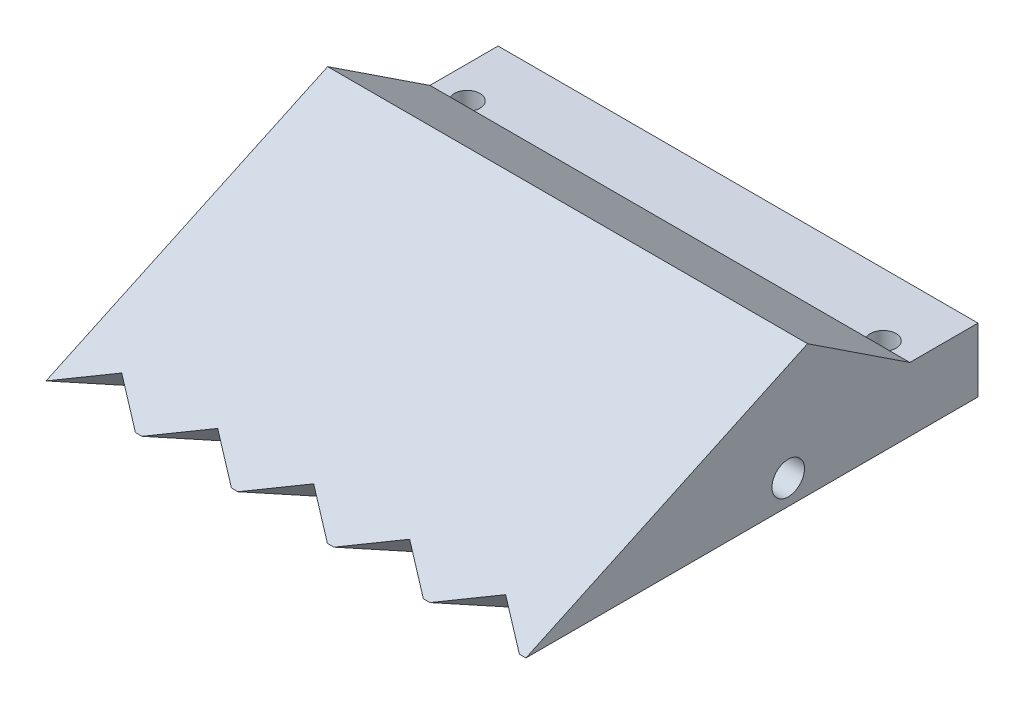
ISO-10303-21;
HEADER;
FILE_DESCRIPTION(('STEP AP214'),'2;1');
FILE_NAME('part.step','',(''),(''),'','','');
FILE_SCHEMA(('AUTOMOTIVE_DESIGN { 1 0 10303 214 1 1 1 1 }'));
ENDSEC;
DATA;
#1=APPLICATION_CONTEXT('core data for automotive mechanical design processes');
#2=APPLICATION_PROTOCOL_DEFINITION('international standard','automotive_design',2000,#1);
#3=PRODUCT_CONTEXT('',#1,'mechanical');
#4=PRODUCT('Part','Part','',(#3));
#5=PRODUCT_RELATED_PRODUCT_CATEGORY('part','',(#4));
#6=PRODUCT_DEFINITION_FORMATION('','',#4);
#7=PRODUCT_DEFINITION_CONTEXT('part definition',#1,'design');
#8=PRODUCT_DEFINITION('design','',#6,#7);
#9=PRODUCT_DEFINITION_SHAPE('','',#8);
#10=(LENGTH_UNIT() NAMED_UNIT(*) SI_UNIT(.MILLI.,.METRE.));
#11=(NAMED_UNIT(*) PLANE_ANGLE_UNIT() SI_UNIT($,.RADIAN.));
#12=(NAMED_UNIT(*) SI_UNIT($,.STERADIAN.) SOLID_ANGLE_UNIT());
#13=UNCERTAINTY_MEASURE_WITH_UNIT(LENGTH_MEASURE(1.E-05),#10,'distance_accuracy_value','');
#14=(GEOMETRIC_REPRESENTATION_CONTEXT(3) GLOBAL_UNCERTAINTY_ASSIGNED_CONTEXT((#13)) GLOBAL_UNIT_ASSIGNED_CONTEXT((#10,
#11,#12)) REPRESENTATION_CONTEXT('',''));
#15=CARTESIAN_POINT('',(0.,0.,0.));
#16=DIRECTION('',(0.,0.,1.));
#17=DIRECTION('',(1.,0.,0.));
#18=AXIS2_PLACEMENT_3D('',#15,#16,#17);
#19=CARTESIAN_POINT('',(75.,24.6994464564003,-8.57109619459907));
#20=DIRECTION('',(0.,-0.906307787036653,-0.422618261740694));
#21=DIRECTION('',(0.,0.422618261740694,-0.906307787036653));
#22=AXIS2_PLACEMENT_3D('',#19,#20,#21);
#23=PLANE('',#22);
#24=DIRECTION('',(0.,-0.422618261740694,0.906307787036653));
#25=VECTOR('',#24,1.);
#26=CARTESIAN_POINT('',(0.,24.6994464564003,-8.57109619459907));
#27=LINE('',#26,#25);
#28=CARTESIAN_POINT('',(0.,24.6994464564003,-8.57109619459907));
#29=VERTEX_POINT('',#28);
#30=CARTESIAN_POINT('',(0.,4.17318887122065,35.4476052489812));
#31=VERTEX_POINT('',#30);
#32=EDGE_CURVE('E256',#29,#31,#27,.T.);
#33=ORIENTED_EDGE('',*,*,#32,.T.);
#34=DIRECTION('',(-0.802159031205733,-0.25234978014748,0.541165849915346));
#35=VECTOR('',#34,1.);
#36=CARTESIAN_POINT('',(0.,4.17318887122065,35.4476052489812));
#37=LINE('',#36,#35);
#38=CARTESIAN_POINT('',(7.06585008190916,6.39602205686052,30.6807240992381));
#39=VERTEX_POINT('',#38);
#40=EDGE_CURVE('E171',#39,#31,#37,.T.);
#41=ORIENTED_EDGE('',*,*,#40,.F.);
#42=DIRECTION('',(-0.795744215045442,0.255951500653194,-0.548889764465591));
#43=VECTOR('',#42,1.);
#44=CARTESIAN_POINT('',(7.06585008190916,6.39602205686052,30.6807240992381));
#45=LINE('',#44,#43);
#46=CARTESIAN_POINT('',(13.9765602905617,4.17318887122065,35.4476052489812));
#47=VERTEX_POINT('',#46);
#48=EDGE_CURVE('E157',#47,#39,#45,.T.);
#49=ORIENTED_EDGE('',*,*,#48,.F.);
#50=DIRECTION('',(-1.,0.,0.));
#51=VECTOR('',#50,1.);
#52=CARTESIAN_POINT('',(75.,4.17318887122065,35.4476052489812));
#53=LINE('',#52,#51);
#54=CARTESIAN_POINT('',(15.,4.17318887122073,35.447605248981));
#55=VERTEX_POINT('',#54);
#56=EDGE_CURVE('E170',#55,#47,#53,.T.);
#57=ORIENTED_EDGE('',*,*,#56,.F.);
#58=DIRECTION('',(-0.802159031205733,-0.25234978014748,0.541165849915346));
#59=VECTOR('',#58,1.);
#60=CARTESIAN_POINT('',(15.,4.17318887122073,35.447605248981));
#61=LINE('',#60,#59);
#62=CARTESIAN_POINT('',(22.0658500819091,6.39602205686061,30.6807240992379));
#63=VERTEX_POINT('',#62);
#64=EDGE_CURVE('E350',#63,#55,#61,.T.);
#65=ORIENTED_EDGE('',*,*,#64,.F.);
#66=DIRECTION('',(-0.795744215045441,0.255951500653194,-0.548889764465591));
#67=VECTOR('',#66,1.);
#68=CARTESIAN_POINT('',(22.0658500819091,6.39602205686061,30.6807240992379));
#69=LINE('',#68,#67);
#70=CARTESIAN_POINT('',(28.9765602905617,4.17318887122073,35.447605248981));
#71=VERTEX_POINT('',#70);
#72=EDGE_CURVE('E235',#71,#63,#69,.T.);
#73=ORIENTED_EDGE('',*,*,#72,.F.);
#74=CARTESIAN_POINT('',(30.,4.17318887122082,35.4476052489808));
#75=VERTEX_POINT('',#74);
#76=EDGE_CURVE('E178',#75,#71,#53,.T.);
#77=ORIENTED_EDGE('',*,*,#76,.F.);
#78=DIRECTION('',(-0.802159031205733,-0.25234978014748,0.541165849915346));
#79=VECTOR('',#78,1.);
#80=CARTESIAN_POINT('',(30.,4.17318887122082,35.4476052489808));
#81=LINE('',#80,#79);
#82=CARTESIAN_POINT('',(37.0658500819091,6.3960220568607,30.6807240992377));
#83=VERTEX_POINT('',#82);
#84=EDGE_CURVE('E220',#83,#75,#81,.T.);
#85=ORIENTED_EDGE('',*,*,#84,.F.);
#86=DIRECTION('',(-0.795744215045441,0.255951500653195,-0.548889764465592));
#87=VECTOR('',#86,1.);
#88=CARTESIAN_POINT('',(37.0658500819091,6.3960220568607,30.6807240992377));
#89=LINE('',#88,#87);
#90=CARTESIAN_POINT('',(43.9765602905616,4.17318887122082,35.4476052489808));
#91=VERTEX_POINT('',#90);
#92=EDGE_CURVE('E218',#91,#83,#89,.T.);
#93=ORIENTED_EDGE('',*,*,#92,.F.);
#94=CARTESIAN_POINT('',(45.,4.17318887122091,35.4476052489806));
#95=VERTEX_POINT('',#94);
#96=EDGE_CURVE('E185',#95,#91,#53,.T.);
#97=ORIENTED_EDGE('',*,*,#96,.F.);
#98=DIRECTION('',(-0.802159031205733,-0.25234978014748,0.541165849915345));
#99=VECTOR('',#98,1.);
#100=CARTESIAN_POINT('',(45.,4.17318887122091,35.4476052489806));
#101=LINE('',#100,#99);
#102=CARTESIAN_POINT('',(52.0658500819091,6.39602205686078,30.6807240992375));
#103=VERTEX_POINT('',#102);
#104=EDGE_CURVE('E215',#103,#95,#101,.T.);
#105=ORIENTED_EDGE('',*,*,#104,.F.);
#106=DIRECTION('',(-0.795744215045441,0.255951500653195,-0.548889764465592));
#107=VECTOR('',#106,1.);
#108=CARTESIAN_POINT('',(52.0658500819091,6.39602205686078,30.6807240992375));
#109=LINE('',#108,#107);
#110=CARTESIAN_POINT('',(58.9765602905616,4.17318887122091,35.4476052489806));
#111=VERTEX_POINT('',#110);
#112=EDGE_CURVE('E236',#111,#103,#109,.T.);
#113=ORIENTED_EDGE('',*,*,#112,.F.);
#114=CARTESIAN_POINT('',(59.9999999999999,4.173188871221,35.4476052489804));
#115=VERTEX_POINT('',#114);
#116=EDGE_CURVE('E193',#115,#111,#53,.T.);
#117=ORIENTED_EDGE('',*,*,#116,.F.);
#118=DIRECTION('',(-0.802159031205733,-0.25234978014748,0.541165849915345));
#119=VECTOR('',#118,1.);
#120=CARTESIAN_POINT('',(59.9999999999999,4.173188871221,35.4476052489804));
#121=LINE('',#120,#119);
#122=CARTESIAN_POINT('',(67.0658500819091,6.39602205686087,30.6807240992373));
#123=VERTEX_POINT('',#122);
#124=EDGE_CURVE('E247',#123,#115,#121,.T.);
#125=ORIENTED_EDGE('',*,*,#124,.F.);
#126=DIRECTION('',(-0.795744215045441,0.255951500653195,-0.548889764465592));
#127=VECTOR('',#126,1.);
#128=CARTESIAN_POINT('',(67.0658500819091,6.39602205686087,30.6807240992373));
#129=LINE('',#128,#127);
#130=CARTESIAN_POINT('',(73.9765602905616,4.173188871221,35.4476052489804));
#131=VERTEX_POINT('',#130);
#132=EDGE_CURVE('E243',#131,#123,#129,.T.);
#133=ORIENTED_EDGE('',*,*,#132,.F.);
#134=CARTESIAN_POINT('',(75.,4.17318887122065,35.4476052489812));
#135=VERTEX_POINT('',#134);
#136=EDGE_CURVE('E181',#135,#131,#53,.T.);
#137=ORIENTED_EDGE('',*,*,#136,.F.);
#138=DIRECTION('',(0.,-0.422618261740694,0.906307787036653));
#139=VECTOR('',#138,1.);
#140=CARTESIAN_POINT('',(75.,24.6994464564003,-8.57109619459907));
#141=LINE('',#140,#139);
#142=CARTESIAN_POINT('',(75.,24.6994464564003,-8.57109619459907));
#143=VERTEX_POINT('',#142);
#144=EDGE_CURVE('E262',#143,#135,#141,.T.);
#145=ORIENTED_EDGE('',*,*,#144,.F.);
#146=DIRECTION('',(-1.,0.,0.));
#147=VECTOR('',#146,1.);
#148=CARTESIAN_POINT('',(75.,24.6994464564003,-8.57109619459907));
#149=LINE('',#148,#147);
#150=EDGE_CURVE('E279',#143,#29,#149,.T.);
#151=ORIENTED_EDGE('',*,*,#150,.T.);
#152=EDGE_LOOP('',(#33,#41,#49,#57,#65,#73,#77,#85,#93,#97,#105,#113,#117,#125,#133,#137,#145,#151));
#153=FACE_BOUND('',#152,.T.);
#154=ADVANCED_FACE('F39',(#153),#23,.F.);
#155=CARTESIAN_POINT('',(75.,4.17318887122065,35.4476052489812));
#156=DIRECTION('',(0.,1.,0.));
#157=DIRECTION('',(0.,0.,1.));
#158=AXIS2_PLACEMENT_3D('',#155,#156,#157);
#159=PLANE('',#158);
#160=CARTESIAN_POINT('',(69.9999989035806,4.17318887122065,-25.3864980543294));
#161=DIRECTION('',(0.,1.,0.));
#162=DIRECTION('',(0.,0.,1.));
#163=AXIS2_PLACEMENT_3D('',#160,#161,#162);
#164=CIRCLE('',#163,3.99999999999999);
#165=CARTESIAN_POINT('',(69.9999989035806,4.17318887122065,-21.3864980543294));
#166=VERTEX_POINT('',#165);
#167=EDGE_CURVE('E377',#166,#166,#164,.T.);
#168=ORIENTED_EDGE('',*,*,#167,.T.);
#169=EDGE_LOOP('',(#168));
#170=FACE_BOUND('',#169,.T.);
#171=CARTESIAN_POINT('',(5.,4.17318887122065,-25.3745592722076));
#172=DIRECTION('',(0.,1.,0.));
#173=DIRECTION('',(0.,0.,1.));
#174=AXIS2_PLACEMENT_3D('',#171,#172,#173);
#175=CIRCLE('',#174,3.99999999999999);
#176=CARTESIAN_POINT('',(5.,4.17318887122065,-21.3745592722076));
#177=VERTEX_POINT('',#176);
#178=EDGE_CURVE('E373',#177,#177,#175,.T.);
#179=ORIENTED_EDGE('',*,*,#178,.T.);
#180=EDGE_LOOP('',(#179));
#181=FACE_BOUND('',#180,.T.);
#182=DIRECTION('',(-0.765791701632656,0.,-0.643088695057347));
#183=VECTOR('',#182,1.);
#184=CARTESIAN_POINT('',(49.7629589494673,4.17318887122065,65.4999398006517));
#185=LINE('',#184,#183);
#186=CARTESIAN_POINT('',(7.06585008190916,4.17318887122065,29.6441999619732));
#187=VERTEX_POINT('',#186);
#188=EDGE_CURVE('E154',#47,#187,#185,.T.);
#189=ORIENTED_EDGE('',*,*,#188,.T.);
#190=DIRECTION('',(-0.772763043523777,0.,0.634694634106724));
#191=VECTOR('',#190,1.);
#192=CARTESIAN_POINT('',(44.7872041077099,4.17318887122065,-1.33753653805802));
#193=LINE('',#192,#191);
#194=EDGE_CURVE('E163',#187,#31,#193,.T.);
#195=ORIENTED_EDGE('',*,*,#194,.T.);
#196=DIRECTION('',(0.,0.,-1.));
#197=VECTOR('',#196,1.);
#198=CARTESIAN_POINT('',(0.,4.17318887122065,35.4476052489812));
#199=LINE('',#198,#197);
#200=CARTESIAN_POINT('',(0.,4.17318887122065,-35.2064814814815));
#201=VERTEX_POINT('',#200);
#202=EDGE_CURVE('E282',#31,#201,#199,.T.);
#203=ORIENTED_EDGE('',*,*,#202,.T.);
#204=DIRECTION('',(-1.,0.,0.));
#205=VECTOR('',#204,1.);
#206=CARTESIAN_POINT('',(75.,4.17318887122065,-35.2064814814815));
#207=LINE('',#206,#205);
#208=CARTESIAN_POINT('',(75.,4.17318887122065,-35.2064814814815));
#209=VERTEX_POINT('',#208);
#210=EDGE_CURVE('E179',#209,#201,#207,.T.);
#211=ORIENTED_EDGE('',*,*,#210,.F.);
#212=DIRECTION('',(0.,0.,-1.));
#213=VECTOR('',#212,1.);
#214=CARTESIAN_POINT('',(75.,4.17318887122065,35.4476052489812));
#215=LINE('',#214,#213);
#216=EDGE_CURVE('E266',#135,#209,#215,.T.);
#217=ORIENTED_EDGE('',*,*,#216,.F.);
#218=ORIENTED_EDGE('',*,*,#136,.T.);
#219=DIRECTION('',(-0.765791701632655,0.,-0.643088695057348));
#220=VECTOR('',#219,1.);
#221=CARTESIAN_POINT('',(74.5767431321014,4.17318887122065,35.9516206353298));
#222=LINE('',#221,#220);
#223=CARTESIAN_POINT('',(67.0658500819091,4.17318887122065,29.6441999619722));
#224=VERTEX_POINT('',#223);
#225=EDGE_CURVE('E192',#131,#224,#222,.T.);
#226=ORIENTED_EDGE('',*,*,#225,.T.);
#227=DIRECTION('',(-0.772763043523779,0.,0.634694634106723));
#228=VECTOR('',#227,1.);
#229=CARTESIAN_POINT('',(68.9574408215415,4.17318887122065,28.0905768915728));
#230=LINE('',#229,#228);
#231=EDGE_CURVE('E198',#224,#115,#230,.T.);
#232=ORIENTED_EDGE('',*,*,#231,.T.);
#233=ORIENTED_EDGE('',*,*,#116,.T.);
#234=DIRECTION('',(-0.765791701632655,0.,-0.643088695057348));
#235=VECTOR('',#234,1.);
#236=CARTESIAN_POINT('',(68.3732970864429,4.17318887122065,43.3387004266603));
#237=LINE('',#236,#235);
#238=CARTESIAN_POINT('',(52.0658500819091,4.17318887122065,29.6441999619725));
#239=VERTEX_POINT('',#238);
#240=EDGE_CURVE('E614',#111,#239,#237,.T.);
#241=ORIENTED_EDGE('',*,*,#240,.T.);
#242=DIRECTION('',(-0.772763043523779,0.,0.634694634106723));
#243=VECTOR('',#242,1.);
#244=CARTESIAN_POINT('',(62.9148816430836,4.17318887122065,20.7335485341651));
#245=LINE('',#244,#243);
#246=EDGE_CURVE('E211',#239,#95,#245,.T.);
#247=ORIENTED_EDGE('',*,*,#246,.T.);
#248=ORIENTED_EDGE('',*,*,#96,.T.);
#249=DIRECTION('',(-0.765791701632655,0.,-0.643088695057348));
#250=VECTOR('',#249,1.);
#251=CARTESIAN_POINT('',(62.1698510407843,4.17318887122065,50.7257802179907));
#252=LINE('',#251,#250);
#253=CARTESIAN_POINT('',(37.0658500819091,4.17318887122065,29.6441999619727));
#254=VERTEX_POINT('',#253);
#255=EDGE_CURVE('E209',#91,#254,#252,.T.);
#256=ORIENTED_EDGE('',*,*,#255,.T.);
#257=DIRECTION('',(-0.772763043523778,0.,0.634694634106723));
#258=VECTOR('',#257,1.);
#259=CARTESIAN_POINT('',(56.8723224646257,4.17318887122065,13.3765201767574));
#260=LINE('',#259,#258);
#261=EDGE_CURVE('E359',#254,#75,#260,.T.);
#262=ORIENTED_EDGE('',*,*,#261,.T.);
#263=ORIENTED_EDGE('',*,*,#76,.T.);
#264=DIRECTION('',(-0.765791701632656,0.,-0.643088695057347));
#265=VECTOR('',#264,1.);
#266=CARTESIAN_POINT('',(55.9664049951258,4.17318887122065,58.1128600093212));
#267=LINE('',#266,#265);
#268=CARTESIAN_POINT('',(22.0658500819092,4.17318887122065,29.6441999619729));
#269=VERTEX_POINT('',#268);
#270=EDGE_CURVE('E357',#71,#269,#267,.T.);
#271=ORIENTED_EDGE('',*,*,#270,.T.);
#272=DIRECTION('',(-0.772763043523778,0.,0.634694634106724));
#273=VECTOR('',#272,1.);
#274=CARTESIAN_POINT('',(50.8297632861678,4.17318887122065,6.01949181934968));
#275=LINE('',#274,#273);
#276=EDGE_CURVE('E164',#269,#55,#275,.T.);
#277=ORIENTED_EDGE('',*,*,#276,.T.);
#278=ORIENTED_EDGE('',*,*,#56,.T.);
#279=EDGE_LOOP('',(#189,#195,#203,#211,#217,#218,#226,#232,#233,#241,#247,#248,#256,#262,#263,
#271,#277,#278));
#280=FACE_BOUND('',#279,.T.);
#281=ADVANCED_FACE('F175',(#170,#181,#280),#159,.F.);
#282=CARTESIAN_POINT('',(75.,4.17318887122065,-35.2064814814815));
#283=DIRECTION('',(0.,0.,1.));
#284=DIRECTION('',(1.,0.,0.));
#285=AXIS2_PLACEMENT_3D('',#282,#283,#284);
#286=PLANE('',#285);
#287=DIRECTION('',(0.,1.,0.));
#288=VECTOR('',#287,1.);
#289=CARTESIAN_POINT('',(0.,4.17318887122065,-35.2064814814815));
#290=LINE('',#289,#288);
#291=CARTESIAN_POINT('',(0.,14.1731888712206,-35.2064814814815));
#292=VERTEX_POINT('',#291);
#293=EDGE_CURVE('E285',#201,#292,#290,.T.);
#294=ORIENTED_EDGE('',*,*,#293,.T.);
#295=DIRECTION('',(-1.,0.,0.));
#296=VECTOR('',#295,1.);
#297=CARTESIAN_POINT('',(75.,14.1731888712206,-35.2064814814815));
#298=LINE('',#297,#296);
#299=CARTESIAN_POINT('',(75.,14.1731888712206,-35.2064814814815));
#300=VERTEX_POINT('',#299);
#301=EDGE_CURVE('E187',#300,#292,#298,.T.);
#302=ORIENTED_EDGE('',*,*,#301,.F.);
#303=DIRECTION('',(0.,1.,0.));
#304=VECTOR('',#303,1.);
#305=CARTESIAN_POINT('',(75.,4.17318887122065,-35.2064814814815));
#306=LINE('',#305,#304);
#307=EDGE_CURVE('E270',#209,#300,#306,.T.);
#308=ORIENTED_EDGE('',*,*,#307,.F.);
#309=ORIENTED_EDGE('',*,*,#210,.T.);
#310=EDGE_LOOP('',(#294,#302,#308,#309));
#311=FACE_BOUND('',#310,.T.);
#312=ADVANCED_FACE('F393',(#311),#286,.F.);
#313=CARTESIAN_POINT('',(75.,14.1731888712206,-35.2064814814815));
#314=DIRECTION('',(0.,-1.,0.));
#315=DIRECTION('',(0.,0.,-1.));
#316=AXIS2_PLACEMENT_3D('',#313,#314,#315);
#317=PLANE('',#316);
#318=DIRECTION('',(-1.,0.,0.));
#319=VECTOR('',#318,1.);
#320=CARTESIAN_POINT('',(75.,14.1731888712206,-24.5523947510188));
#321=LINE('',#320,#319);
#322=CARTESIAN_POINT('',(3.1768034938333,14.1731888712206,-24.5523947510188));
#323=VERTEX_POINT('',#322);
#324=CARTESIAN_POINT('',(0.,14.1731888712206,-24.5523947510188));
#325=VERTEX_POINT('',#324);
#326=EDGE_CURVE('E297',#323,#325,#321,.T.);
#327=ORIENTED_EDGE('',*,*,#326,.F.);
#328=CARTESIAN_POINT('',(5.,14.1731888712206,-25.3745592722076));
#329=DIRECTION('',(0.,1.,0.));
#330=DIRECTION('',(0.,0.,1.));
#331=AXIS2_PLACEMENT_3D('',#328,#329,#330);
#332=CIRCLE('',#331,2.);
#333=CARTESIAN_POINT('',(6.8231965061667,14.1731888712206,-24.5523947510188));
#334=VERTEX_POINT('',#333);
#335=EDGE_CURVE('E253',#334,#323,#332,.T.);
#336=ORIENTED_EDGE('',*,*,#335,.F.);
#337=CARTESIAN_POINT('',(68.1822333302994,14.1731888712206,-24.5523947510188));
#338=VERTEX_POINT('',#337);
#339=EDGE_CURVE('E335',#338,#334,#321,.T.);
#340=ORIENTED_EDGE('',*,*,#339,.F.);
#341=CARTESIAN_POINT('',(69.9999989035806,14.1731888712206,-25.3864980543294));
#342=DIRECTION('',(0.,1.,0.));
#343=DIRECTION('',(0.,0.,1.));
#344=AXIS2_PLACEMENT_3D('',#341,#342,#343);
#345=CIRCLE('',#344,2.);
#346=CARTESIAN_POINT('',(71.8177644768618,14.1731888712206,-24.5523947510188));
#347=VERTEX_POINT('',#346);
#348=EDGE_CURVE('E258',#347,#338,#345,.T.);
#349=ORIENTED_EDGE('',*,*,#348,.F.);
#350=CARTESIAN_POINT('',(75.,14.1731888712206,-24.5523947510188));
#351=VERTEX_POINT('',#350);
#352=EDGE_CURVE('E298',#351,#347,#321,.T.);
#353=ORIENTED_EDGE('',*,*,#352,.F.);
#354=DIRECTION('',(0.,0.,1.));
#355=VECTOR('',#354,1.);
#356=CARTESIAN_POINT('',(75.,14.1731888712206,-35.2064814814815));
#357=LINE('',#356,#355);
#358=EDGE_CURVE('E273',#300,#351,#357,.T.);
#359=ORIENTED_EDGE('',*,*,#358,.F.);
#360=ORIENTED_EDGE('',*,*,#301,.T.);
#361=DIRECTION('',(0.,0.,1.));
#362=VECTOR('',#361,1.);
#363=CARTESIAN_POINT('',(0.,14.1731888712206,-35.2064814814815));
#364=LINE('',#363,#362);
#365=EDGE_CURVE('E288',#292,#325,#364,.T.);
#366=ORIENTED_EDGE('',*,*,#365,.T.);
#367=EDGE_LOOP('',(#327,#336,#340,#349,#353,#359,#360,#366));
#368=FACE_BOUND('',#367,.T.);
#369=ADVANCED_FACE('F310',(#368),#317,.F.);
#370=CARTESIAN_POINT('',(75.,14.1731888712206,-24.5523947510188));
#371=DIRECTION('',(0.,-0.835123148029079,0.550063021503901));
#372=DIRECTION('',(0.,-0.550063021503901,-0.835123148029079));
#373=AXIS2_PLACEMENT_3D('',#370,#371,#372);
#374=PLANE('',#373);
#375=DIRECTION('',(0.,0.550063021503901,0.835123148029079));
#376=VECTOR('',#375,1.);
#377=CARTESIAN_POINT('',(0.,14.1731888712206,-24.5523947510188));
#378=LINE('',#377,#376);
#379=EDGE_CURVE('E267',#325,#29,#378,.T.);
#380=ORIENTED_EDGE('',*,*,#379,.T.);
#381=ORIENTED_EDGE('',*,*,#150,.F.);
#382=DIRECTION('',(0.,0.550063021503901,0.835123148029079));
#383=VECTOR('',#382,1.);
#384=CARTESIAN_POINT('',(75.,14.1731888712206,-24.5523947510188));
#385=LINE('',#384,#383);
#386=EDGE_CURVE('E276',#351,#143,#385,.T.);
#387=ORIENTED_EDGE('',*,*,#386,.F.);
#388=ORIENTED_EDGE('',*,*,#352,.T.);
#389=EDGE_CURVE('E302',#347,#338,#321,.T.);
#390=ORIENTED_EDGE('',*,*,#389,.T.);
#391=ORIENTED_EDGE('',*,*,#339,.T.);
#392=EDGE_CURVE('E624',#334,#323,#321,.T.);
#393=ORIENTED_EDGE('',*,*,#392,.T.);
#394=ORIENTED_EDGE('',*,*,#326,.T.);
#395=EDGE_LOOP('',(#380,#381,#387,#388,#390,#391,#393,#394));
#396=FACE_BOUND('',#395,.T.);
#397=ADVANCED_FACE('F322',(#396),#374,.F.);
#398=CARTESIAN_POINT('',(75.,0.,0.));
#399=DIRECTION('',(-1.,0.,0.));
#400=DIRECTION('',(0.,0.,1.));
#401=AXIS2_PLACEMENT_3D('',#398,#399,#400);
#402=PLANE('',#401);
#403=CARTESIAN_POINT('',(75.,8.033515634858,-5.54758710562415));
#404=DIRECTION('',(-1.,0.,0.));
#405=DIRECTION('',(0.,0.,1.));
#406=AXIS2_PLACEMENT_3D('',#403,#404,#405);
#407=CIRCLE('',#406,2.54300844368567);
#408=CARTESIAN_POINT('',(75.,8.033515634858,-3.00457866193848));
#409=VERTEX_POINT('',#408);
#410=EDGE_CURVE('E248',#409,#409,#407,.T.);
#411=ORIENTED_EDGE('',*,*,#410,.T.);
#412=EDGE_LOOP('',(#411));
#413=FACE_BOUND('',#412,.T.);
#414=ORIENTED_EDGE('',*,*,#144,.T.);
#415=ORIENTED_EDGE('',*,*,#216,.T.);
#416=ORIENTED_EDGE('',*,*,#307,.T.);
#417=ORIENTED_EDGE('',*,*,#358,.T.);
#418=ORIENTED_EDGE('',*,*,#386,.T.);
#419=EDGE_LOOP('',(#414,#415,#416,#417,#418));
#420=FACE_BOUND('',#419,.T.);
#421=ADVANCED_FACE('F328',(#413,#420),#402,.F.);
#422=CARTESIAN_POINT('',(0.,0.,0.));
#423=DIRECTION('',(-1.,0.,0.));
#424=DIRECTION('',(0.,0.,1.));
#425=AXIS2_PLACEMENT_3D('',#422,#423,#424);
#426=PLANE('',#425);
#427=CARTESIAN_POINT('',(0.,8.033515634858,-5.54758710562415));
#428=DIRECTION('',(-1.,0.,0.));
#429=DIRECTION('',(0.,0.,1.));
#430=AXIS2_PLACEMENT_3D('',#427,#428,#429);
#431=CIRCLE('',#430,2.54300844368567);
#432=CARTESIAN_POINT('',(0.,8.033515634858,-3.00457866193848));
#433=VERTEX_POINT('',#432);
#434=EDGE_CURVE('E469',#433,#433,#431,.T.);
#435=ORIENTED_EDGE('',*,*,#434,.F.);
#436=EDGE_LOOP('',(#435));
#437=FACE_BOUND('',#436,.T.);
#438=ORIENTED_EDGE('',*,*,#32,.F.);
#439=ORIENTED_EDGE('',*,*,#379,.F.);
#440=ORIENTED_EDGE('',*,*,#365,.F.);
#441=ORIENTED_EDGE('',*,*,#293,.F.);
#442=ORIENTED_EDGE('',*,*,#202,.F.);
#443=EDGE_LOOP('',(#438,#439,#440,#441,#442));
#444=FACE_BOUND('',#443,.T.);
#445=ADVANCED_FACE('F318',(#437,#444),#426,.T.);
#446=CARTESIAN_POINT('',(69.9999989035806,14.1731888712206,-25.3864980543294));
#447=DIRECTION('',(0.,1.,0.));
#448=DIRECTION('',(0.,0.,1.));
#449=AXIS2_PLACEMENT_3D('',#446,#447,#448);
#450=PLANE('',#449);
#451=EDGE_CURVE('E261',#338,#347,#345,.T.);
#452=ORIENTED_EDGE('',*,*,#451,.F.);
#453=ORIENTED_EDGE('',*,*,#389,.F.);
#454=EDGE_LOOP('',(#452,#453));
#455=FACE_BOUND('',#454,.T.);
#456=ADVANCED_FACE('F341',(#455),#450,.F.);
#457=CARTESIAN_POINT('',(69.9999989035806,4.17318887122064,-25.3864980543294));
#458=DIRECTION('',(0.,1.,0.));
#459=DIRECTION('',(0.,0.,1.));
#460=AXIS2_PLACEMENT_3D('',#457,#458,#459);
#461=CYLINDRICAL_SURFACE('',#460,2.);
#462=CARTESIAN_POINT('',(69.9999989035806,6.17318887122064,-25.3864980543294));
#463=DIRECTION('',(0.,1.,0.));
#464=DIRECTION('',(0.,0.,1.));
#465=AXIS2_PLACEMENT_3D('',#462,#463,#464);
#466=CIRCLE('',#465,2.);
#467=CARTESIAN_POINT('',(69.9999989035806,6.17318887122064,-23.3864980543294));
#468=VERTEX_POINT('',#467);
#469=EDGE_CURVE('E48',#468,#468,#466,.F.);
#470=ORIENTED_EDGE('',*,*,#469,.T.);
#471=EDGE_LOOP('',(#470));
#472=FACE_BOUND('',#471,.T.);
#473=ORIENTED_EDGE('',*,*,#348,.T.);
#474=ORIENTED_EDGE('',*,*,#451,.T.);
#475=EDGE_LOOP('',(#473,#474));
#476=FACE_BOUND('',#475,.T.);
#477=ADVANCED_FACE('F339',(#472,#476),#461,.F.);
#478=CARTESIAN_POINT('',(5.,14.1731888712206,-25.3745592722076));
#479=DIRECTION('',(0.,1.,0.));
#480=DIRECTION('',(0.,0.,1.));
#481=AXIS2_PLACEMENT_3D('',#478,#479,#480);
#482=PLANE('',#481);
#483=EDGE_CURVE('E257',#323,#334,#332,.T.);
#484=ORIENTED_EDGE('',*,*,#483,.F.);
#485=ORIENTED_EDGE('',*,*,#392,.F.);
#486=EDGE_LOOP('',(#484,#485));
#487=FACE_BOUND('',#486,.T.);
#488=ADVANCED_FACE('F421',(#487),#482,.F.);
#489=CARTESIAN_POINT('',(5.,4.17318887122064,-25.3745592722076));
#490=DIRECTION('',(0.,1.,0.));
#491=DIRECTION('',(0.,0.,1.));
#492=AXIS2_PLACEMENT_3D('',#489,#490,#491);
#493=CYLINDRICAL_SURFACE('',#492,2.);
#494=CARTESIAN_POINT('',(5.,6.17318887122064,-25.3745592722076));
#495=DIRECTION('',(0.,1.,0.));
#496=DIRECTION('',(0.,0.,1.));
#497=AXIS2_PLACEMENT_3D('',#494,#495,#496);
#498=CIRCLE('',#497,2.);
#499=CARTESIAN_POINT('',(5.,6.17318887122064,-23.3745592722076));
#500=VERTEX_POINT('',#499);
#501=EDGE_CURVE('E11',#500,#500,#498,.F.);
#502=ORIENTED_EDGE('',*,*,#501,.T.);
#503=EDGE_LOOP('',(#502));
#504=FACE_BOUND('',#503,.T.);
#505=ORIENTED_EDGE('',*,*,#335,.T.);
#506=ORIENTED_EDGE('',*,*,#483,.T.);
#507=EDGE_LOOP('',(#505,#506));
#508=FACE_BOUND('',#507,.T.);
#509=ADVANCED_FACE('F424',(#504,#508),#493,.F.);
#510=CARTESIAN_POINT('',(59.9999999999999,-4.88988899914553,31.2214226315735));
#511=DIRECTION('',(-0.59711044929316,0.339007055407766,-0.727002976423533));
#512=DIRECTION('',(-0.772763043523779,0.,0.634694634106723));
#513=AXIS2_PLACEMENT_3D('',#510,#511,#512);
#514=PLANE('',#513);
#515=DIRECTION('',(0.,0.906307787036653,0.422618261740694));
#516=VECTOR('',#515,1.);
#517=CARTESIAN_POINT('',(67.0658500819091,-2.66705581350565,26.4545414818304));
#518=LINE('',#517,#516);
#519=EDGE_CURVE('E240',#224,#123,#518,.T.);
#520=ORIENTED_EDGE('',*,*,#519,.T.);
#521=ORIENTED_EDGE('',*,*,#124,.T.);
#522=ORIENTED_EDGE('',*,*,#231,.F.);
#523=EDGE_LOOP('',(#520,#521,#522));
#524=FACE_BOUND('',#523,.T.);
#525=ADVANCED_FACE('F427',(#524),#514,.F.);
#526=CARTESIAN_POINT('',(67.0658500819091,-2.66705581350565,26.4545414818304));
#527=DIRECTION('',(0.605632846055856,0.336296036952717,-0.721189178585051));
#528=DIRECTION('',(-0.765791701632655,0.,-0.643088695057348));
#529=AXIS2_PLACEMENT_3D('',#526,#527,#528);
#530=PLANE('',#529);
#531=ORIENTED_EDGE('',*,*,#132,.T.);
#532=ORIENTED_EDGE('',*,*,#519,.F.);
#533=ORIENTED_EDGE('',*,*,#225,.F.);
#534=EDGE_LOOP('',(#531,#532,#533));
#535=FACE_BOUND('',#534,.T.);
#536=ADVANCED_FACE('F432',(#535),#530,.F.);
#537=CARTESIAN_POINT('',(45.,-4.88988899914562,31.2214226315737));
#538=DIRECTION('',(-0.59711044929316,0.339007055407766,-0.727002976423533));
#539=DIRECTION('',(-0.772763043523779,0.,0.634694634106723));
#540=AXIS2_PLACEMENT_3D('',#537,#538,#539);
#541=PLANE('',#540);
#542=DIRECTION('',(0.,0.906307787036653,0.422618261740694));
#543=VECTOR('',#542,1.);
#544=CARTESIAN_POINT('',(52.0658500819091,-2.66705581350574,26.4545414818306));
#545=LINE('',#544,#543);
#546=EDGE_CURVE('E223',#239,#103,#545,.T.);
#547=ORIENTED_EDGE('',*,*,#546,.T.);
#548=ORIENTED_EDGE('',*,*,#104,.T.);
#549=ORIENTED_EDGE('',*,*,#246,.F.);
#550=EDGE_LOOP('',(#547,#548,#549));
#551=FACE_BOUND('',#550,.T.);
#552=ADVANCED_FACE('F435',(#551),#541,.F.);
#553=CARTESIAN_POINT('',(52.0658500819091,-2.66705581350574,26.4545414818306));
#554=DIRECTION('',(0.605632846055855,0.336296036952717,-0.721189178585051));
#555=DIRECTION('',(-0.765791701632655,0.,-0.643088695057348));
#556=AXIS2_PLACEMENT_3D('',#553,#554,#555);
#557=PLANE('',#556);
#558=ORIENTED_EDGE('',*,*,#112,.T.);
#559=ORIENTED_EDGE('',*,*,#546,.F.);
#560=ORIENTED_EDGE('',*,*,#240,.F.);
#561=EDGE_LOOP('',(#558,#559,#560));
#562=FACE_BOUND('',#561,.T.);
#563=ADVANCED_FACE('F440',(#562),#557,.F.);
#564=CARTESIAN_POINT('',(30.,-4.8898889991457,31.2214226315739));
#565=DIRECTION('',(-0.59711044929316,0.339007055407766,-0.727002976423533));
#566=DIRECTION('',(-0.772763043523778,0.,0.634694634106723));
#567=AXIS2_PLACEMENT_3D('',#564,#565,#566);
#568=PLANE('',#567);
#569=DIRECTION('',(0.,0.906307787036653,0.422618261740694));
#570=VECTOR('',#569,1.);
#571=CARTESIAN_POINT('',(37.0658500819091,-2.66705581350583,26.4545414818308));
#572=LINE('',#571,#570);
#573=EDGE_CURVE('E227',#254,#83,#572,.T.);
#574=ORIENTED_EDGE('',*,*,#573,.T.);
#575=ORIENTED_EDGE('',*,*,#84,.T.);
#576=ORIENTED_EDGE('',*,*,#261,.F.);
#577=EDGE_LOOP('',(#574,#575,#576));
#578=FACE_BOUND('',#577,.T.);
#579=ADVANCED_FACE('F443',(#578),#568,.F.);
#580=CARTESIAN_POINT('',(37.0658500819091,-2.66705581350583,26.4545414818308));
#581=DIRECTION('',(0.605632846055855,0.336296036952717,-0.721189178585052));
#582=DIRECTION('',(-0.765791701632655,0.,-0.643088695057348));
#583=AXIS2_PLACEMENT_3D('',#580,#581,#582);
#584=PLANE('',#583);
#585=ORIENTED_EDGE('',*,*,#92,.T.);
#586=ORIENTED_EDGE('',*,*,#573,.F.);
#587=ORIENTED_EDGE('',*,*,#255,.F.);
#588=EDGE_LOOP('',(#585,#586,#587));
#589=FACE_BOUND('',#588,.T.);
#590=ADVANCED_FACE('F448',(#589),#584,.F.);
#591=CARTESIAN_POINT('',(15.,-4.88988899914579,31.221422631574));
#592=DIRECTION('',(-0.597110449293161,0.339007055407766,-0.727002976423533));
#593=DIRECTION('',(-0.772763043523778,0.,0.634694634106724));
#594=AXIS2_PLACEMENT_3D('',#591,#592,#593);
#595=PLANE('',#594);
#596=DIRECTION('',(0.,0.906307787036653,0.422618261740694));
#597=VECTOR('',#596,1.);
#598=CARTESIAN_POINT('',(22.0658500819091,-2.66705581350592,26.4545414818309));
#599=LINE('',#598,#597);
#600=EDGE_CURVE('E63',#269,#63,#599,.T.);
#601=ORIENTED_EDGE('',*,*,#600,.T.);
#602=ORIENTED_EDGE('',*,*,#64,.T.);
#603=ORIENTED_EDGE('',*,*,#276,.F.);
#604=EDGE_LOOP('',(#601,#602,#603));
#605=FACE_BOUND('',#604,.T.);
#606=ADVANCED_FACE('F354',(#605),#595,.F.);
#607=CARTESIAN_POINT('',(22.0658500819091,-2.66705581350592,26.4545414818309));
#608=DIRECTION('',(0.605632846055855,0.336296036952717,-0.721189178585052));
#609=DIRECTION('',(-0.765791701632656,0.,-0.643088695057347));
#610=AXIS2_PLACEMENT_3D('',#607,#608,#609);
#611=PLANE('',#610);
#612=ORIENTED_EDGE('',*,*,#72,.T.);
#613=ORIENTED_EDGE('',*,*,#600,.F.);
#614=ORIENTED_EDGE('',*,*,#270,.F.);
#615=EDGE_LOOP('',(#612,#613,#614));
#616=FACE_BOUND('',#615,.T.);
#617=ADVANCED_FACE('F356',(#616),#611,.F.);
#618=CARTESIAN_POINT('',(0.,-4.88988899914588,31.2214226315742));
#619=DIRECTION('',(-0.597110449293161,0.339007055407766,-0.727002976423533));
#620=DIRECTION('',(-0.772763043523777,0.,0.634694634106724));
#621=AXIS2_PLACEMENT_3D('',#618,#619,#620);
#622=PLANE('',#621);
#623=DIRECTION('',(0.,0.906307787036653,0.422618261740694));
#624=VECTOR('',#623,1.);
#625=CARTESIAN_POINT('',(7.06585008190916,-2.66705581350601,26.4545414818311));
#626=LINE('',#625,#624);
#627=EDGE_CURVE('E55',#187,#39,#626,.T.);
#628=ORIENTED_EDGE('',*,*,#627,.T.);
#629=ORIENTED_EDGE('',*,*,#40,.T.);
#630=ORIENTED_EDGE('',*,*,#194,.F.);
#631=EDGE_LOOP('',(#628,#629,#630));
#632=FACE_BOUND('',#631,.T.);
#633=ADVANCED_FACE('F455',(#632),#622,.F.);
#634=CARTESIAN_POINT('',(7.06585008190916,-2.66705581350601,26.4545414818311));
#635=DIRECTION('',(0.605632846055854,0.336296036952717,-0.721189178585052));
#636=DIRECTION('',(-0.765791701632656,0.,-0.643088695057347));
#637=AXIS2_PLACEMENT_3D('',#634,#635,#636);
#638=PLANE('',#637);
#639=ORIENTED_EDGE('',*,*,#48,.T.);
#640=ORIENTED_EDGE('',*,*,#627,.F.);
#641=ORIENTED_EDGE('',*,*,#188,.F.);
#642=EDGE_LOOP('',(#639,#640,#641));
#643=FACE_BOUND('',#642,.T.);
#644=ADVANCED_FACE('F156',(#643),#638,.F.);
#645=CARTESIAN_POINT('',(100.,8.033515634858,-5.54758710562415));
#646=DIRECTION('',(-1.,0.,0.));
#647=DIRECTION('',(0.,0.,1.));
#648=AXIS2_PLACEMENT_3D('',#645,#646,#647);
#649=CYLINDRICAL_SURFACE('',#648,2.54300844368567);
#650=ORIENTED_EDGE('',*,*,#434,.T.);
#651=EDGE_LOOP('',(#650));
#652=FACE_BOUND('',#651,.T.);
#653=ORIENTED_EDGE('',*,*,#410,.F.);
#654=EDGE_LOOP('',(#653));
#655=FACE_BOUND('',#654,.T.);
#656=ADVANCED_FACE('F388',(#652,#655),#649,.F.);
#657=CARTESIAN_POINT('',(69.9999989035806,4.17318887122065,-25.3864980543294));
#658=DIRECTION('',(0.,-1.,0.));
#659=DIRECTION('',(0.,0.,-1.));
#660=AXIS2_PLACEMENT_3D('',#657,#658,#659);
#661=CONICAL_SURFACE('',#660,3.99999999999999,0.785398163397447);
#662=ORIENTED_EDGE('',*,*,#469,.F.);
#663=EDGE_LOOP('',(#662));
#664=FACE_BOUND('',#663,.T.);
#665=ORIENTED_EDGE('',*,*,#167,.F.);
#666=EDGE_LOOP('',(#665));
#667=FACE_BOUND('',#666,.T.);
#668=ADVANCED_FACE('F385',(#664,#667),#661,.F.);
#669=CARTESIAN_POINT('',(5.,4.17318887122065,-25.3745592722076));
#670=DIRECTION('',(0.,-1.,0.));
#671=DIRECTION('',(0.,0.,-1.));
#672=AXIS2_PLACEMENT_3D('',#669,#670,#671);
#673=CONICAL_SURFACE('',#672,3.99999999999999,0.785398163397447);
#674=ORIENTED_EDGE('',*,*,#501,.F.);
#675=EDGE_LOOP('',(#674));
#676=FACE_BOUND('',#675,.T.);
#677=ORIENTED_EDGE('',*,*,#178,.F.);
#678=EDGE_LOOP('',(#677));
#679=FACE_BOUND('',#678,.T.);
#680=ADVANCED_FACE('F41',(#676,#679),#673,.F.);
#681=CLOSED_SHELL('',(#154,#281,#312,#369,#397,#421,#445,#456,#477,#488,#509,#525,#536,#552,
#563,#579,#590,#606,#617,#633,#644,#656,#668,#680));
#682=MANIFOLD_SOLID_BREP('B2',#681);
#683=ADVANCED_BREP_SHAPE_REPRESENTATION('',(#18,#682),#14);
#684=SHAPE_DEFINITION_REPRESENTATION(#9,#683);
ENDSEC;
END-ISO-10303-21;
